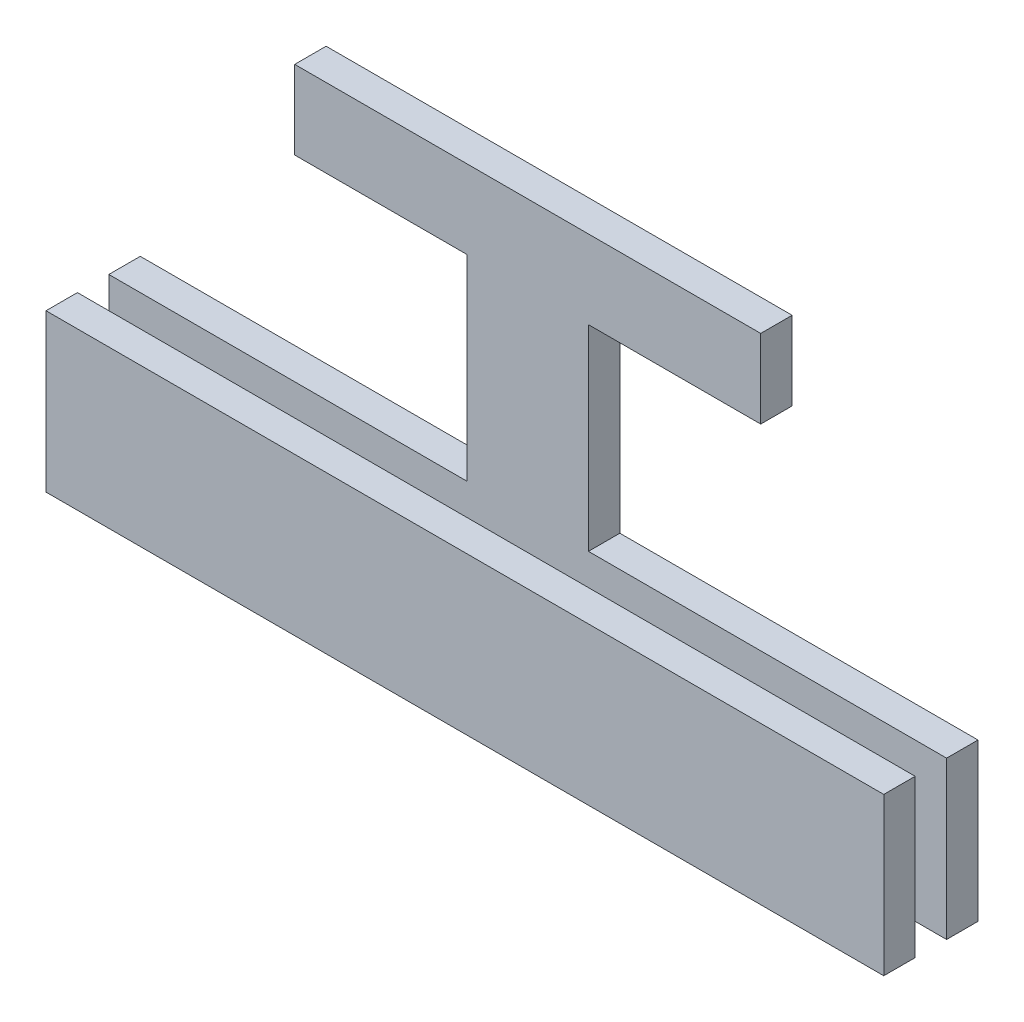
ISO-10303-21;
HEADER;
FILE_DESCRIPTION(('STEP AP214'),'2;1');
FILE_NAME('part.step','',(''),(''),'','','');
FILE_SCHEMA(('AUTOMOTIVE_DESIGN { 1 0 10303 214 1 1 1 1 }'));
ENDSEC;
DATA;
#1=APPLICATION_CONTEXT('core data for automotive mechanical design processes');
#2=APPLICATION_PROTOCOL_DEFINITION('international standard','automotive_design',2000,#1);
#3=PRODUCT_CONTEXT('',#1,'mechanical');
#4=PRODUCT('Part','Part','',(#3));
#5=PRODUCT_RELATED_PRODUCT_CATEGORY('part','',(#4));
#6=PRODUCT_DEFINITION_FORMATION('','',#4);
#7=PRODUCT_DEFINITION_CONTEXT('part definition',#1,'design');
#8=PRODUCT_DEFINITION('design','',#6,#7);
#9=PRODUCT_DEFINITION_SHAPE('','',#8);
#10=(LENGTH_UNIT() NAMED_UNIT(*) SI_UNIT(.MILLI.,.METRE.));
#11=(NAMED_UNIT(*) PLANE_ANGLE_UNIT() SI_UNIT($,.RADIAN.));
#12=(NAMED_UNIT(*) SI_UNIT($,.STERADIAN.) SOLID_ANGLE_UNIT());
#13=UNCERTAINTY_MEASURE_WITH_UNIT(LENGTH_MEASURE(1.E-05),#10,'distance_accuracy_value','');
#14=(GEOMETRIC_REPRESENTATION_CONTEXT(3) GLOBAL_UNCERTAINTY_ASSIGNED_CONTEXT((#13)) GLOBAL_UNIT_ASSIGNED_CONTEXT((#10,
#11,#12)) REPRESENTATION_CONTEXT('',''));
#15=CARTESIAN_POINT('',(0.,0.,0.));
#16=DIRECTION('',(0.,0.,1.));
#17=DIRECTION('',(1.,0.,0.));
#18=AXIS2_PLACEMENT_3D('',#15,#16,#17);
#19=CARTESIAN_POINT('',(-40.,-7.5,-6.));
#20=DIRECTION('',(1.,0.,0.));
#21=DIRECTION('',(0.,0.,-1.));
#22=AXIS2_PLACEMENT_3D('',#19,#20,#21);
#23=PLANE('',#22);
#24=DIRECTION('',(0.,1.,0.));
#25=VECTOR('',#24,1.);
#26=CARTESIAN_POINT('',(-40.,-7.5,-3.));
#27=LINE('',#26,#25);
#28=CARTESIAN_POINT('',(-40.,-7.5,-3.));
#29=VERTEX_POINT('',#28);
#30=CARTESIAN_POINT('',(-40.,7.5,-3.));
#31=VERTEX_POINT('',#30);
#32=EDGE_CURVE('E163',#29,#31,#27,.T.);
#33=ORIENTED_EDGE('',*,*,#32,.T.);
#34=DIRECTION('',(0.,0.,1.));
#35=VECTOR('',#34,1.);
#36=CARTESIAN_POINT('',(-40.,7.5,-6.));
#37=LINE('',#36,#35);
#38=CARTESIAN_POINT('',(-40.,7.5,-6.));
#39=VERTEX_POINT('',#38);
#40=EDGE_CURVE('E12',#39,#31,#37,.T.);
#41=ORIENTED_EDGE('',*,*,#40,.F.);
#42=DIRECTION('',(0.,1.,0.));
#43=VECTOR('',#42,1.);
#44=CARTESIAN_POINT('',(-40.,-7.5,-6.));
#45=LINE('',#44,#43);
#46=CARTESIAN_POINT('',(-40.,-7.5,-6.));
#47=VERTEX_POINT('',#46);
#48=EDGE_CURVE('E185',#47,#39,#45,.T.);
#49=ORIENTED_EDGE('',*,*,#48,.F.);
#50=DIRECTION('',(0.,0.,1.));
#51=VECTOR('',#50,1.);
#52=CARTESIAN_POINT('',(-40.,-7.5,-6.));
#53=LINE('',#52,#51);
#54=EDGE_CURVE('E159',#47,#29,#53,.T.);
#55=ORIENTED_EDGE('',*,*,#54,.T.);
#56=EDGE_LOOP('',(#33,#41,#49,#55));
#57=FACE_BOUND('',#56,.T.);
#58=ADVANCED_FACE('F43',(#57),#23,.F.);
#59=CARTESIAN_POINT('',(-40.,7.5,-6.));
#60=DIRECTION('',(0.,-1.,0.));
#61=DIRECTION('',(1.,0.,0.));
#62=AXIS2_PLACEMENT_3D('',#59,#60,#61);
#63=PLANE('',#62);
#64=DIRECTION('',(1.,0.,0.));
#65=VECTOR('',#64,1.);
#66=CARTESIAN_POINT('',(-40.,7.5,-3.));
#67=LINE('',#66,#65);
#68=CARTESIAN_POINT('',(-5.80000000000001,7.5,-3.));
#69=VERTEX_POINT('',#68);
#70=EDGE_CURVE('E166',#31,#69,#67,.T.);
#71=ORIENTED_EDGE('',*,*,#70,.T.);
#72=DIRECTION('',(0.,0.,1.));
#73=VECTOR('',#72,1.);
#74=CARTESIAN_POINT('',(-5.80000000000001,7.5,-6.));
#75=LINE('',#74,#73);
#76=CARTESIAN_POINT('',(-5.80000000000001,7.5,-6.));
#77=VERTEX_POINT('',#76);
#78=EDGE_CURVE('E51',#77,#69,#75,.T.);
#79=ORIENTED_EDGE('',*,*,#78,.F.);
#80=DIRECTION('',(1.,0.,0.));
#81=VECTOR('',#80,1.);
#82=CARTESIAN_POINT('',(-40.,7.5,-6.));
#83=LINE('',#82,#81);
#84=EDGE_CURVE('E114',#39,#77,#83,.T.);
#85=ORIENTED_EDGE('',*,*,#84,.F.);
#86=ORIENTED_EDGE('',*,*,#40,.T.);
#87=EDGE_LOOP('',(#71,#79,#85,#86));
#88=FACE_BOUND('',#87,.T.);
#89=ADVANCED_FACE('F263',(#88),#63,.F.);
#90=CARTESIAN_POINT('',(-5.80000000000001,26.25,-6.));
#91=DIRECTION('',(1.,0.,0.));
#92=DIRECTION('',(0.,0.,-1.));
#93=AXIS2_PLACEMENT_3D('',#90,#91,#92);
#94=PLANE('',#93);
#95=DIRECTION('',(0.,1.,0.));
#96=VECTOR('',#95,1.);
#97=CARTESIAN_POINT('',(-5.80000000000001,26.25,-3.));
#98=LINE('',#97,#96);
#99=CARTESIAN_POINT('',(-5.80000000000001,26.25,-3.));
#100=VERTEX_POINT('',#99);
#101=EDGE_CURVE('E168',#69,#100,#98,.T.);
#102=ORIENTED_EDGE('',*,*,#101,.T.);
#103=DIRECTION('',(0.,0.,1.));
#104=VECTOR('',#103,1.);
#105=CARTESIAN_POINT('',(-5.80000000000001,26.25,-6.));
#106=LINE('',#105,#104);
#107=CARTESIAN_POINT('',(-5.80000000000001,26.25,-6.));
#108=VERTEX_POINT('',#107);
#109=EDGE_CURVE('E204',#108,#100,#106,.T.);
#110=ORIENTED_EDGE('',*,*,#109,.F.);
#111=DIRECTION('',(0.,1.,0.));
#112=VECTOR('',#111,1.);
#113=CARTESIAN_POINT('',(-5.80000000000001,26.25,-6.));
#114=LINE('',#113,#112);
#115=EDGE_CURVE('E212',#77,#108,#114,.T.);
#116=ORIENTED_EDGE('',*,*,#115,.F.);
#117=ORIENTED_EDGE('',*,*,#78,.T.);
#118=EDGE_LOOP('',(#102,#110,#116,#117));
#119=FACE_BOUND('',#118,.T.);
#120=ADVANCED_FACE('F210',(#119),#94,.F.);
#121=CARTESIAN_POINT('',(-22.25,26.25,-6.));
#122=DIRECTION('',(0.,1.,0.));
#123=DIRECTION('',(0.,0.,1.));
#124=AXIS2_PLACEMENT_3D('',#121,#122,#123);
#125=PLANE('',#124);
#126=DIRECTION('',(-1.,0.,0.));
#127=VECTOR('',#126,1.);
#128=CARTESIAN_POINT('',(-22.25,26.25,-3.));
#129=LINE('',#128,#127);
#130=CARTESIAN_POINT('',(-22.25,26.25,-3.));
#131=VERTEX_POINT('',#130);
#132=EDGE_CURVE('E170',#100,#131,#129,.T.);
#133=ORIENTED_EDGE('',*,*,#132,.T.);
#134=DIRECTION('',(0.,0.,1.));
#135=VECTOR('',#134,1.);
#136=CARTESIAN_POINT('',(-22.25,26.25,-6.));
#137=LINE('',#136,#135);
#138=CARTESIAN_POINT('',(-22.25,26.25,-6.));
#139=VERTEX_POINT('',#138);
#140=EDGE_CURVE('E201',#139,#131,#137,.T.);
#141=ORIENTED_EDGE('',*,*,#140,.F.);
#142=DIRECTION('',(-1.,0.,0.));
#143=VECTOR('',#142,1.);
#144=CARTESIAN_POINT('',(-22.25,26.25,-6.));
#145=LINE('',#144,#143);
#146=EDGE_CURVE('E230',#108,#139,#145,.T.);
#147=ORIENTED_EDGE('',*,*,#146,.F.);
#148=ORIENTED_EDGE('',*,*,#109,.T.);
#149=EDGE_LOOP('',(#133,#141,#147,#148));
#150=FACE_BOUND('',#149,.T.);
#151=ADVANCED_FACE('F221',(#150),#125,.F.);
#152=CARTESIAN_POINT('',(-22.25,26.25,-6.));
#153=DIRECTION('',(1.,0.,0.));
#154=DIRECTION('',(0.,0.,-1.));
#155=AXIS2_PLACEMENT_3D('',#152,#153,#154);
#156=PLANE('',#155);
#157=DIRECTION('',(0.,1.,0.));
#158=VECTOR('',#157,1.);
#159=CARTESIAN_POINT('',(-22.25,26.25,-3.));
#160=LINE('',#159,#158);
#161=CARTESIAN_POINT('',(-22.25,33.75,-3.));
#162=VERTEX_POINT('',#161);
#163=EDGE_CURVE('E172',#131,#162,#160,.T.);
#164=ORIENTED_EDGE('',*,*,#163,.T.);
#165=DIRECTION('',(0.,0.,1.));
#166=VECTOR('',#165,1.);
#167=CARTESIAN_POINT('',(-22.25,33.75,-6.));
#168=LINE('',#167,#166);
#169=CARTESIAN_POINT('',(-22.25,33.75,-6.));
#170=VERTEX_POINT('',#169);
#171=EDGE_CURVE('E198',#170,#162,#168,.T.);
#172=ORIENTED_EDGE('',*,*,#171,.F.);
#173=DIRECTION('',(0.,1.,0.));
#174=VECTOR('',#173,1.);
#175=CARTESIAN_POINT('',(-22.25,26.25,-6.));
#176=LINE('',#175,#174);
#177=EDGE_CURVE('E227',#139,#170,#176,.T.);
#178=ORIENTED_EDGE('',*,*,#177,.F.);
#179=ORIENTED_EDGE('',*,*,#140,.T.);
#180=EDGE_LOOP('',(#164,#172,#178,#179));
#181=FACE_BOUND('',#180,.T.);
#182=ADVANCED_FACE('F225',(#181),#156,.F.);
#183=CARTESIAN_POINT('',(-22.25,33.75,-6.));
#184=DIRECTION('',(0.,-1.,0.));
#185=DIRECTION('',(1.,0.,0.));
#186=AXIS2_PLACEMENT_3D('',#183,#184,#185);
#187=PLANE('',#186);
#188=DIRECTION('',(1.,0.,0.));
#189=VECTOR('',#188,1.);
#190=CARTESIAN_POINT('',(-22.25,33.75,-3.));
#191=LINE('',#190,#189);
#192=CARTESIAN_POINT('',(22.25,33.75,-3.));
#193=VERTEX_POINT('',#192);
#194=EDGE_CURVE('E174',#162,#193,#191,.T.);
#195=ORIENTED_EDGE('',*,*,#194,.T.);
#196=DIRECTION('',(0.,0.,1.));
#197=VECTOR('',#196,1.);
#198=CARTESIAN_POINT('',(22.25,33.75,-6.));
#199=LINE('',#198,#197);
#200=CARTESIAN_POINT('',(22.25,33.75,-6.));
#201=VERTEX_POINT('',#200);
#202=EDGE_CURVE('E195',#201,#193,#199,.T.);
#203=ORIENTED_EDGE('',*,*,#202,.F.);
#204=DIRECTION('',(1.,0.,0.));
#205=VECTOR('',#204,1.);
#206=CARTESIAN_POINT('',(-22.25,33.75,-6.));
#207=LINE('',#206,#205);
#208=EDGE_CURVE('E229',#170,#201,#207,.T.);
#209=ORIENTED_EDGE('',*,*,#208,.F.);
#210=ORIENTED_EDGE('',*,*,#171,.T.);
#211=EDGE_LOOP('',(#195,#203,#209,#210));
#212=FACE_BOUND('',#211,.T.);
#213=ADVANCED_FACE('F276',(#212),#187,.F.);
#214=CARTESIAN_POINT('',(22.25,26.25,-6.));
#215=DIRECTION('',(-1.,0.,0.));
#216=DIRECTION('',(0.,0.,1.));
#217=AXIS2_PLACEMENT_3D('',#214,#215,#216);
#218=PLANE('',#217);
#219=DIRECTION('',(0.,-1.,0.));
#220=VECTOR('',#219,1.);
#221=CARTESIAN_POINT('',(22.25,26.25,-3.));
#222=LINE('',#221,#220);
#223=CARTESIAN_POINT('',(22.25,26.25,-3.));
#224=VERTEX_POINT('',#223);
#225=EDGE_CURVE('E176',#193,#224,#222,.T.);
#226=ORIENTED_EDGE('',*,*,#225,.T.);
#227=DIRECTION('',(0.,0.,1.));
#228=VECTOR('',#227,1.);
#229=CARTESIAN_POINT('',(22.25,26.25,-6.));
#230=LINE('',#229,#228);
#231=CARTESIAN_POINT('',(22.25,26.25,-6.));
#232=VERTEX_POINT('',#231);
#233=EDGE_CURVE('E192',#232,#224,#230,.T.);
#234=ORIENTED_EDGE('',*,*,#233,.F.);
#235=DIRECTION('',(0.,-1.,0.));
#236=VECTOR('',#235,1.);
#237=CARTESIAN_POINT('',(22.25,26.25,-6.));
#238=LINE('',#237,#236);
#239=EDGE_CURVE('E232',#201,#232,#238,.T.);
#240=ORIENTED_EDGE('',*,*,#239,.F.);
#241=ORIENTED_EDGE('',*,*,#202,.T.);
#242=EDGE_LOOP('',(#226,#234,#240,#241));
#243=FACE_BOUND('',#242,.T.);
#244=ADVANCED_FACE('F279',(#243),#218,.F.);
#245=CARTESIAN_POINT('',(5.79999999999999,26.25,-6.));
#246=DIRECTION('',(0.,1.,0.));
#247=DIRECTION('',(-1.,0.,0.));
#248=AXIS2_PLACEMENT_3D('',#245,#246,#247);
#249=PLANE('',#248);
#250=DIRECTION('',(-1.,0.,0.));
#251=VECTOR('',#250,1.);
#252=CARTESIAN_POINT('',(5.79999999999999,26.25,-3.));
#253=LINE('',#252,#251);
#254=CARTESIAN_POINT('',(5.79999999999999,26.25,-3.));
#255=VERTEX_POINT('',#254);
#256=EDGE_CURVE('E178',#224,#255,#253,.T.);
#257=ORIENTED_EDGE('',*,*,#256,.T.);
#258=DIRECTION('',(0.,0.,1.));
#259=VECTOR('',#258,1.);
#260=CARTESIAN_POINT('',(5.79999999999999,26.25,-6.));
#261=LINE('',#260,#259);
#262=CARTESIAN_POINT('',(5.79999999999999,26.25,-6.));
#263=VERTEX_POINT('',#262);
#264=EDGE_CURVE('E189',#263,#255,#261,.T.);
#265=ORIENTED_EDGE('',*,*,#264,.F.);
#266=DIRECTION('',(-1.,0.,0.));
#267=VECTOR('',#266,1.);
#268=CARTESIAN_POINT('',(5.79999999999999,26.25,-6.));
#269=LINE('',#268,#267);
#270=EDGE_CURVE('E238',#232,#263,#269,.T.);
#271=ORIENTED_EDGE('',*,*,#270,.F.);
#272=ORIENTED_EDGE('',*,*,#233,.T.);
#273=EDGE_LOOP('',(#257,#265,#271,#272));
#274=FACE_BOUND('',#273,.T.);
#275=ADVANCED_FACE('F244',(#274),#249,.F.);
#276=CARTESIAN_POINT('',(5.79999999999999,26.25,-6.));
#277=DIRECTION('',(-1.,0.,0.));
#278=DIRECTION('',(0.,0.,1.));
#279=AXIS2_PLACEMENT_3D('',#276,#277,#278);
#280=PLANE('',#279);
#281=DIRECTION('',(0.,-1.,0.));
#282=VECTOR('',#281,1.);
#283=CARTESIAN_POINT('',(5.79999999999999,26.25,-3.));
#284=LINE('',#283,#282);
#285=CARTESIAN_POINT('',(5.79999999999999,7.5,-3.));
#286=VERTEX_POINT('',#285);
#287=EDGE_CURVE('E180',#255,#286,#284,.T.);
#288=ORIENTED_EDGE('',*,*,#287,.T.);
#289=DIRECTION('',(0.,0.,1.));
#290=VECTOR('',#289,1.);
#291=CARTESIAN_POINT('',(5.79999999999999,7.5,-6.));
#292=LINE('',#291,#290);
#293=CARTESIAN_POINT('',(5.79999999999999,7.5,-6.));
#294=VERTEX_POINT('',#293);
#295=EDGE_CURVE('E154',#294,#286,#292,.T.);
#296=ORIENTED_EDGE('',*,*,#295,.F.);
#297=DIRECTION('',(0.,-1.,0.));
#298=VECTOR('',#297,1.);
#299=CARTESIAN_POINT('',(5.79999999999999,26.25,-6.));
#300=LINE('',#299,#298);
#301=EDGE_CURVE('E145',#263,#294,#300,.T.);
#302=ORIENTED_EDGE('',*,*,#301,.F.);
#303=ORIENTED_EDGE('',*,*,#264,.T.);
#304=EDGE_LOOP('',(#288,#296,#302,#303));
#305=FACE_BOUND('',#304,.T.);
#306=ADVANCED_FACE('F248',(#305),#280,.F.);
#307=CARTESIAN_POINT('',(5.79999999999999,7.5,-6.));
#308=DIRECTION('',(0.,-1.,0.));
#309=DIRECTION('',(1.,0.,0.));
#310=AXIS2_PLACEMENT_3D('',#307,#308,#309);
#311=PLANE('',#310);
#312=DIRECTION('',(1.,0.,0.));
#313=VECTOR('',#312,1.);
#314=CARTESIAN_POINT('',(5.79999999999999,7.5,-3.));
#315=LINE('',#314,#313);
#316=CARTESIAN_POINT('',(40.,7.49999999999999,-3.));
#317=VERTEX_POINT('',#316);
#318=EDGE_CURVE('E153',#286,#317,#315,.T.);
#319=ORIENTED_EDGE('',*,*,#318,.T.);
#320=DIRECTION('',(0.,0.,1.));
#321=VECTOR('',#320,1.);
#322=CARTESIAN_POINT('',(40.,7.49999999999999,-6.));
#323=LINE('',#322,#321);
#324=CARTESIAN_POINT('',(40.,7.49999999999999,-6.));
#325=VERTEX_POINT('',#324);
#326=EDGE_CURVE('E150',#325,#317,#323,.T.);
#327=ORIENTED_EDGE('',*,*,#326,.F.);
#328=DIRECTION('',(1.,0.,0.));
#329=VECTOR('',#328,1.);
#330=CARTESIAN_POINT('',(5.79999999999999,7.5,-6.));
#331=LINE('',#330,#329);
#332=EDGE_CURVE('E139',#294,#325,#331,.T.);
#333=ORIENTED_EDGE('',*,*,#332,.F.);
#334=ORIENTED_EDGE('',*,*,#295,.T.);
#335=EDGE_LOOP('',(#319,#327,#333,#334));
#336=FACE_BOUND('',#335,.T.);
#337=ADVANCED_FACE('F151',(#336),#311,.F.);
#338=CARTESIAN_POINT('',(40.,-7.50000000000001,-6.));
#339=DIRECTION('',(-1.,0.,0.));
#340=DIRECTION('',(0.,0.,1.));
#341=AXIS2_PLACEMENT_3D('',#338,#339,#340);
#342=PLANE('',#341);
#343=DIRECTION('',(0.,-1.,0.));
#344=VECTOR('',#343,1.);
#345=CARTESIAN_POINT('',(40.,-7.50000000000001,-3.));
#346=LINE('',#345,#344);
#347=CARTESIAN_POINT('',(40.,-7.50000000000001,-3.));
#348=VERTEX_POINT('',#347);
#349=EDGE_CURVE('E100',#317,#348,#346,.T.);
#350=ORIENTED_EDGE('',*,*,#349,.T.);
#351=DIRECTION('',(0.,0.,1.));
#352=VECTOR('',#351,1.);
#353=CARTESIAN_POINT('',(40.,-7.50000000000001,-6.));
#354=LINE('',#353,#352);
#355=CARTESIAN_POINT('',(40.,-7.50000000000001,-6.));
#356=VERTEX_POINT('',#355);
#357=EDGE_CURVE('E155',#356,#348,#354,.T.);
#358=ORIENTED_EDGE('',*,*,#357,.F.);
#359=DIRECTION('',(0.,-1.,0.));
#360=VECTOR('',#359,1.);
#361=CARTESIAN_POINT('',(40.,-7.50000000000001,-6.));
#362=LINE('',#361,#360);
#363=EDGE_CURVE('E143',#325,#356,#362,.T.);
#364=ORIENTED_EDGE('',*,*,#363,.F.);
#365=ORIENTED_EDGE('',*,*,#326,.T.);
#366=EDGE_LOOP('',(#350,#358,#364,#365));
#367=FACE_BOUND('',#366,.T.);
#368=ADVANCED_FACE('F157',(#367),#342,.F.);
#369=CARTESIAN_POINT('',(-40.,-7.5,-6.));
#370=DIRECTION('',(0.,1.,0.));
#371=DIRECTION('',(-1.,0.,0.));
#372=AXIS2_PLACEMENT_3D('',#369,#370,#371);
#373=PLANE('',#372);
#374=DIRECTION('',(-1.,0.,0.));
#375=VECTOR('',#374,1.);
#376=CARTESIAN_POINT('',(-40.,-7.5,-3.));
#377=LINE('',#376,#375);
#378=EDGE_CURVE('E106',#348,#29,#377,.T.);
#379=ORIENTED_EDGE('',*,*,#378,.T.);
#380=ORIENTED_EDGE('',*,*,#54,.F.);
#381=DIRECTION('',(-1.,0.,0.));
#382=VECTOR('',#381,1.);
#383=CARTESIAN_POINT('',(-40.,-7.5,-6.));
#384=LINE('',#383,#382);
#385=EDGE_CURVE('E59',#356,#47,#384,.T.);
#386=ORIENTED_EDGE('',*,*,#385,.F.);
#387=ORIENTED_EDGE('',*,*,#357,.T.);
#388=EDGE_LOOP('',(#379,#380,#386,#387));
#389=FACE_BOUND('',#388,.T.);
#390=ADVANCED_FACE('F252',(#389),#373,.F.);
#391=CARTESIAN_POINT('',(0.,0.,-6.));
#392=DIRECTION('',(0.,0.,-1.));
#393=DIRECTION('',(-1.,0.,0.));
#394=AXIS2_PLACEMENT_3D('',#391,#392,#393);
#395=PLANE('',#394);
#396=ORIENTED_EDGE('',*,*,#48,.T.);
#397=ORIENTED_EDGE('',*,*,#84,.T.);
#398=ORIENTED_EDGE('',*,*,#115,.T.);
#399=ORIENTED_EDGE('',*,*,#146,.T.);
#400=ORIENTED_EDGE('',*,*,#177,.T.);
#401=ORIENTED_EDGE('',*,*,#208,.T.);
#402=ORIENTED_EDGE('',*,*,#239,.T.);
#403=ORIENTED_EDGE('',*,*,#270,.T.);
#404=ORIENTED_EDGE('',*,*,#301,.T.);
#405=ORIENTED_EDGE('',*,*,#332,.T.);
#406=ORIENTED_EDGE('',*,*,#363,.T.);
#407=ORIENTED_EDGE('',*,*,#385,.T.);
#408=EDGE_LOOP('',(#396,#397,#398,#399,#400,#401,#402,#403,#404,#405,#406,#407));
#409=FACE_BOUND('',#408,.T.);
#410=ADVANCED_FACE('F141',(#409),#395,.T.);
#411=CARTESIAN_POINT('',(0.,0.,-3.));
#412=DIRECTION('',(0.,0.,-1.));
#413=DIRECTION('',(-1.,0.,0.));
#414=AXIS2_PLACEMENT_3D('',#411,#412,#413);
#415=PLANE('',#414);
#416=ORIENTED_EDGE('',*,*,#32,.F.);
#417=ORIENTED_EDGE('',*,*,#378,.F.);
#418=ORIENTED_EDGE('',*,*,#349,.F.);
#419=ORIENTED_EDGE('',*,*,#318,.F.);
#420=ORIENTED_EDGE('',*,*,#287,.F.);
#421=ORIENTED_EDGE('',*,*,#256,.F.);
#422=ORIENTED_EDGE('',*,*,#225,.F.);
#423=ORIENTED_EDGE('',*,*,#194,.F.);
#424=ORIENTED_EDGE('',*,*,#163,.F.);
#425=ORIENTED_EDGE('',*,*,#132,.F.);
#426=ORIENTED_EDGE('',*,*,#101,.F.);
#427=ORIENTED_EDGE('',*,*,#70,.F.);
#428=EDGE_LOOP('',(#416,#417,#418,#419,#420,#421,#422,#423,#424,#425,#426,#427));
#429=FACE_BOUND('',#428,.T.);
#430=ADVANCED_FACE('F216',(#429),#415,.F.);
#431=CLOSED_SHELL('',(#58,#89,#120,#151,#182,#213,#244,#275,#306,#337,#368,#390,#410,#430));
#432=MANIFOLD_SOLID_BREP('B2',#431);
#433=CARTESIAN_POINT('',(-40.,-7.50000000000001,3.));
#434=DIRECTION('',(1.,0.,0.));
#435=DIRECTION('',(0.,0.,-1.));
#436=AXIS2_PLACEMENT_3D('',#433,#434,#435);
#437=PLANE('',#436);
#438=DIRECTION('',(0.,-1.,0.));
#439=VECTOR('',#438,1.);
#440=CARTESIAN_POINT('',(-40.,-7.50000000000001,0.));
#441=LINE('',#440,#439);
#442=CARTESIAN_POINT('',(-40.,7.49999999999999,0.));
#443=VERTEX_POINT('',#442);
#444=CARTESIAN_POINT('',(-40.,-7.50000000000001,0.));
#445=VERTEX_POINT('',#444);
#446=EDGE_CURVE('E438',#443,#445,#441,.T.);
#447=ORIENTED_EDGE('',*,*,#446,.T.);
#448=DIRECTION('',(0.,0.,-1.));
#449=VECTOR('',#448,1.);
#450=CARTESIAN_POINT('',(-40.,-7.50000000000001,3.));
#451=LINE('',#450,#449);
#452=CARTESIAN_POINT('',(-40.,-7.50000000000001,3.));
#453=VERTEX_POINT('',#452);
#454=EDGE_CURVE('E41',#453,#445,#451,.T.);
#455=ORIENTED_EDGE('',*,*,#454,.F.);
#456=DIRECTION('',(0.,-1.,0.));
#457=VECTOR('',#456,1.);
#458=CARTESIAN_POINT('',(-40.,-7.50000000000001,3.));
#459=LINE('',#458,#457);
#460=CARTESIAN_POINT('',(-40.,7.49999999999999,3.));
#461=VERTEX_POINT('',#460);
#462=EDGE_CURVE('E426',#461,#453,#459,.T.);
#463=ORIENTED_EDGE('',*,*,#462,.F.);
#464=DIRECTION('',(0.,0.,-1.));
#465=VECTOR('',#464,1.);
#466=CARTESIAN_POINT('',(-40.,7.49999999999999,3.));
#467=LINE('',#466,#465);
#468=EDGE_CURVE('E434',#461,#443,#467,.T.);
#469=ORIENTED_EDGE('',*,*,#468,.T.);
#470=EDGE_LOOP('',(#447,#455,#463,#469));
#471=FACE_BOUND('',#470,.T.);
#472=ADVANCED_FACE('F375',(#471),#437,.F.);
#473=CARTESIAN_POINT('',(40.,-7.5,3.));
#474=DIRECTION('',(0.,1.,0.));
#475=DIRECTION('',(-1.,0.,0.));
#476=AXIS2_PLACEMENT_3D('',#473,#474,#475);
#477=PLANE('',#476);
#478=DIRECTION('',(1.,0.,0.));
#479=VECTOR('',#478,1.);
#480=CARTESIAN_POINT('',(40.,-7.5,0.));
#481=LINE('',#480,#479);
#482=CARTESIAN_POINT('',(40.,-7.5,0.));
#483=VERTEX_POINT('',#482);
#484=EDGE_CURVE('E430',#445,#483,#481,.T.);
#485=ORIENTED_EDGE('',*,*,#484,.T.);
#486=DIRECTION('',(0.,0.,-1.));
#487=VECTOR('',#486,1.);
#488=CARTESIAN_POINT('',(40.,-7.5,3.));
#489=LINE('',#488,#487);
#490=CARTESIAN_POINT('',(40.,-7.5,3.));
#491=VERTEX_POINT('',#490);
#492=EDGE_CURVE('E383',#491,#483,#489,.T.);
#493=ORIENTED_EDGE('',*,*,#492,.F.);
#494=DIRECTION('',(1.,0.,0.));
#495=VECTOR('',#494,1.);
#496=CARTESIAN_POINT('',(40.,-7.5,3.));
#497=LINE('',#496,#495);
#498=EDGE_CURVE('E421',#453,#491,#497,.T.);
#499=ORIENTED_EDGE('',*,*,#498,.F.);
#500=ORIENTED_EDGE('',*,*,#454,.T.);
#501=EDGE_LOOP('',(#485,#493,#499,#500));
#502=FACE_BOUND('',#501,.T.);
#503=ADVANCED_FACE('F429',(#502),#477,.F.);
#504=CARTESIAN_POINT('',(40.,-7.5,3.));
#505=DIRECTION('',(-1.,0.,0.));
#506=DIRECTION('',(0.,0.,1.));
#507=AXIS2_PLACEMENT_3D('',#504,#505,#506);
#508=PLANE('',#507);
#509=DIRECTION('',(0.,1.,0.));
#510=VECTOR('',#509,1.);
#511=CARTESIAN_POINT('',(40.,-7.5,0.));
#512=LINE('',#511,#510);
#513=CARTESIAN_POINT('',(40.,7.5,0.));
#514=VERTEX_POINT('',#513);
#515=EDGE_CURVE('E408',#483,#514,#512,.T.);
#516=ORIENTED_EDGE('',*,*,#515,.T.);
#517=DIRECTION('',(0.,0.,-1.));
#518=VECTOR('',#517,1.);
#519=CARTESIAN_POINT('',(40.,7.5,3.));
#520=LINE('',#519,#518);
#521=CARTESIAN_POINT('',(40.,7.5,3.));
#522=VERTEX_POINT('',#521);
#523=EDGE_CURVE('E431',#522,#514,#520,.T.);
#524=ORIENTED_EDGE('',*,*,#523,.F.);
#525=DIRECTION('',(0.,1.,0.));
#526=VECTOR('',#525,1.);
#527=CARTESIAN_POINT('',(40.,-7.5,3.));
#528=LINE('',#527,#526);
#529=EDGE_CURVE('E424',#491,#522,#528,.T.);
#530=ORIENTED_EDGE('',*,*,#529,.F.);
#531=ORIENTED_EDGE('',*,*,#492,.T.);
#532=EDGE_LOOP('',(#516,#524,#530,#531));
#533=FACE_BOUND('',#532,.T.);
#534=ADVANCED_FACE('F432',(#533),#508,.F.);
#535=CARTESIAN_POINT('',(40.,7.5,3.));
#536=DIRECTION('',(0.,-1.,0.));
#537=DIRECTION('',(1.,0.,0.));
#538=AXIS2_PLACEMENT_3D('',#535,#536,#537);
#539=PLANE('',#538);
#540=DIRECTION('',(-1.,0.,0.));
#541=VECTOR('',#540,1.);
#542=CARTESIAN_POINT('',(40.,7.5,0.));
#543=LINE('',#542,#541);
#544=EDGE_CURVE('E414',#514,#443,#543,.T.);
#545=ORIENTED_EDGE('',*,*,#544,.T.);
#546=ORIENTED_EDGE('',*,*,#468,.F.);
#547=DIRECTION('',(-1.,0.,0.));
#548=VECTOR('',#547,1.);
#549=CARTESIAN_POINT('',(40.,7.5,3.));
#550=LINE('',#549,#548);
#551=EDGE_CURVE('E391',#522,#461,#550,.T.);
#552=ORIENTED_EDGE('',*,*,#551,.F.);
#553=ORIENTED_EDGE('',*,*,#523,.T.);
#554=EDGE_LOOP('',(#545,#546,#552,#553));
#555=FACE_BOUND('',#554,.T.);
#556=ADVANCED_FACE('F445',(#555),#539,.F.);
#557=CARTESIAN_POINT('',(0.,0.,3.));
#558=DIRECTION('',(0.,0.,1.));
#559=DIRECTION('',(1.,0.,0.));
#560=AXIS2_PLACEMENT_3D('',#557,#558,#559);
#561=PLANE('',#560);
#562=ORIENTED_EDGE('',*,*,#462,.T.);
#563=ORIENTED_EDGE('',*,*,#498,.T.);
#564=ORIENTED_EDGE('',*,*,#529,.T.);
#565=ORIENTED_EDGE('',*,*,#551,.T.);
#566=EDGE_LOOP('',(#562,#563,#564,#565));
#567=FACE_BOUND('',#566,.T.);
#568=ADVANCED_FACE('F422',(#567),#561,.T.);
#569=CARTESIAN_POINT('',(0.,0.,0.));
#570=DIRECTION('',(0.,0.,1.));
#571=DIRECTION('',(1.,0.,0.));
#572=AXIS2_PLACEMENT_3D('',#569,#570,#571);
#573=PLANE('',#572);
#574=ORIENTED_EDGE('',*,*,#446,.F.);
#575=ORIENTED_EDGE('',*,*,#544,.F.);
#576=ORIENTED_EDGE('',*,*,#515,.F.);
#577=ORIENTED_EDGE('',*,*,#484,.F.);
#578=EDGE_LOOP('',(#574,#575,#576,#577));
#579=FACE_BOUND('',#578,.T.);
#580=ADVANCED_FACE('F448',(#579),#573,.F.);
#581=CLOSED_SHELL('',(#472,#503,#534,#556,#568,#580));
#582=MANIFOLD_SOLID_BREP('B6',#581);
#583=ADVANCED_BREP_SHAPE_REPRESENTATION('',(#18,#432,#582),#14);
#584=SHAPE_DEFINITION_REPRESENTATION(#9,#583);
ENDSEC;
END-ISO-10303-21;
